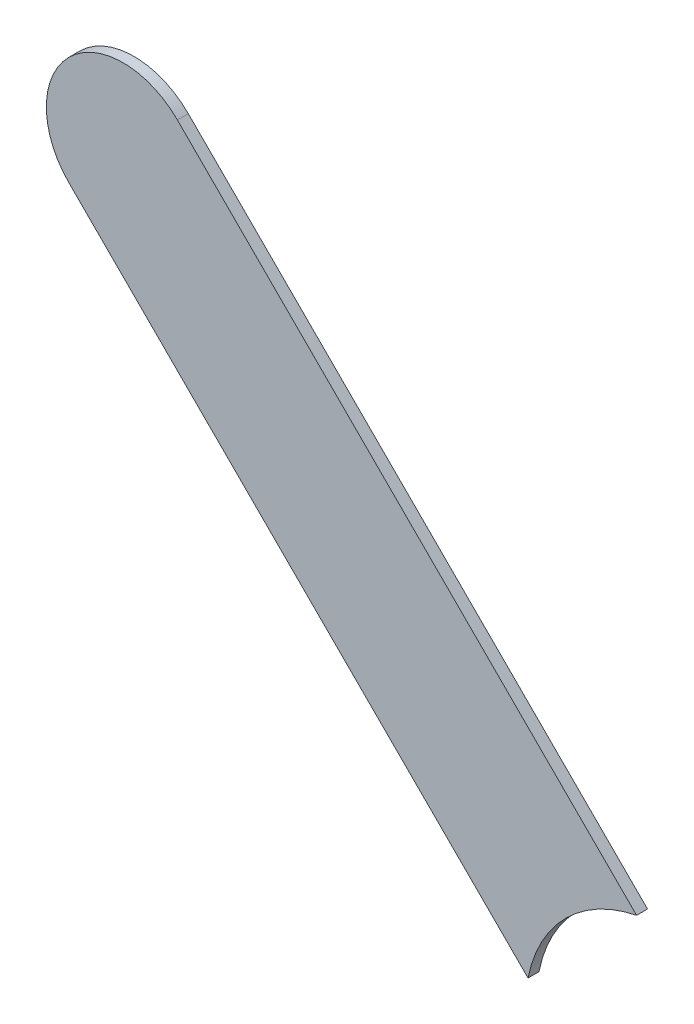
ISO-10303-21;
HEADER;
FILE_DESCRIPTION(('STEP AP214'),'2;1');
FILE_NAME('part.step','',(''),(''),'','','');
FILE_SCHEMA(('AUTOMOTIVE_DESIGN { 1 0 10303 214 1 1 1 1 }'));
ENDSEC;
DATA;
#1=APPLICATION_CONTEXT('core data for automotive mechanical design processes');
#2=APPLICATION_PROTOCOL_DEFINITION('international standard','automotive_design',2000,#1);
#3=PRODUCT_CONTEXT('',#1,'mechanical');
#4=PRODUCT('Part','Part','',(#3));
#5=PRODUCT_RELATED_PRODUCT_CATEGORY('part','',(#4));
#6=PRODUCT_DEFINITION_FORMATION('','',#4);
#7=PRODUCT_DEFINITION_CONTEXT('part definition',#1,'design');
#8=PRODUCT_DEFINITION('design','',#6,#7);
#9=PRODUCT_DEFINITION_SHAPE('','',#8);
#10=(LENGTH_UNIT() NAMED_UNIT(*) SI_UNIT(.MILLI.,.METRE.));
#11=(NAMED_UNIT(*) PLANE_ANGLE_UNIT() SI_UNIT($,.RADIAN.));
#12=(NAMED_UNIT(*) SI_UNIT($,.STERADIAN.) SOLID_ANGLE_UNIT());
#13=UNCERTAINTY_MEASURE_WITH_UNIT(LENGTH_MEASURE(1.E-05),#10,'distance_accuracy_value','');
#14=(GEOMETRIC_REPRESENTATION_CONTEXT(3) GLOBAL_UNCERTAINTY_ASSIGNED_CONTEXT((#13)) GLOBAL_UNIT_ASSIGNED_CONTEXT((#10,
#11,#12)) REPRESENTATION_CONTEXT('',''));
#15=CARTESIAN_POINT('',(0.,0.,0.));
#16=DIRECTION('',(0.,0.,1.));
#17=DIRECTION('',(1.,0.,0.));
#18=AXIS2_PLACEMENT_3D('',#15,#16,#17);
#19=CARTESIAN_POINT('',(43.92321162,55.5832391,0.));
#20=DIRECTION('',(0.707106781186546,0.707106781186549,0.));
#21=DIRECTION('',(0.707106781186549,-0.707106781186546,0.));
#22=AXIS2_PLACEMENT_3D('',#19,#20,#21);
#23=PLANE('',#22);
#24=DIRECTION('',(0.707106781186549,-0.707106781186546,0.));
#25=VECTOR('',#24,1.);
#26=CARTESIAN_POINT('',(43.92321162,55.5832391,0.03556));
#27=LINE('',#26,#25);
#28=CARTESIAN_POINT('',(43.92321162,55.5832391,0.03556));
#29=VERTEX_POINT('',#28);
#30=CARTESIAN_POINT('',(45.4186589236052,54.0877917963948,0.03556));
#31=VERTEX_POINT('',#30);
#32=EDGE_CURVE('E11',#29,#31,#27,.T.);
#33=ORIENTED_EDGE('',*,*,#32,.F.);
#34=DIRECTION('',(0.,0.,1.));
#35=VECTOR('',#34,1.);
#36=CARTESIAN_POINT('',(43.92321162,55.5832391,0.));
#37=LINE('',#36,#35);
#38=CARTESIAN_POINT('',(43.92321162,55.5832391,0.));
#39=VERTEX_POINT('',#38);
#40=EDGE_CURVE('E24',#39,#29,#37,.T.);
#41=ORIENTED_EDGE('',*,*,#40,.F.);
#42=DIRECTION('',(0.707106781186549,-0.707106781186546,0.));
#43=VECTOR('',#42,1.);
#44=CARTESIAN_POINT('',(43.92321162,55.5832391,0.));
#45=LINE('',#44,#43);
#46=CARTESIAN_POINT('',(45.4186589236052,54.0877917963948,0.));
#47=VERTEX_POINT('',#46);
#48=EDGE_CURVE('E75',#39,#47,#45,.T.);
#49=ORIENTED_EDGE('',*,*,#48,.T.);
#50=DIRECTION('',(0.,0.,1.));
#51=VECTOR('',#50,1.);
#52=CARTESIAN_POINT('',(45.4186589236052,54.0877917963948,0.));
#53=LINE('',#52,#51);
#54=EDGE_CURVE('E37',#47,#31,#53,.T.);
#55=ORIENTED_EDGE('',*,*,#54,.T.);
#56=EDGE_LOOP('',(#33,#41,#49,#55));
#57=FACE_BOUND('',#56,.T.);
#58=ADVANCED_FACE('F17',(#57),#23,.F.);
#59=CARTESIAN_POINT('',(45.86000988,53.9999936,0.));
#60=DIRECTION('',(0.,0.,-1.));
#61=DIRECTION('',(1.,0.,0.));
#62=AXIS2_PLACEMENT_3D('',#59,#60,#61);
#63=CYLINDRICAL_SURFACE('',#62,0.4499991);
#64=DIRECTION('',(0.,0.,1.));
#65=VECTOR('',#64,1.);
#66=CARTESIAN_POINT('',(45.7722116836052,54.4413445563948,0.));
#67=LINE('',#66,#65);
#68=CARTESIAN_POINT('',(45.7722116836052,54.4413445563948,0.));
#69=VERTEX_POINT('',#68);
#70=CARTESIAN_POINT('',(45.7722116836052,54.4413445563948,0.03556));
#71=VERTEX_POINT('',#70);
#72=EDGE_CURVE('E67',#69,#71,#67,.T.);
#73=ORIENTED_EDGE('',*,*,#72,.T.);
#74=CARTESIAN_POINT('',(45.86000988,53.9999936,0.03556));
#75=DIRECTION('',(0.,0.,1.));
#76=DIRECTION('',(1.,0.,0.));
#77=AXIS2_PLACEMENT_3D('',#74,#75,#76);
#78=CIRCLE('',#77,0.4499991);
#79=EDGE_CURVE('E82',#71,#31,#78,.T.);
#80=ORIENTED_EDGE('',*,*,#79,.T.);
#81=ORIENTED_EDGE('',*,*,#54,.F.);
#82=CARTESIAN_POINT('',(45.86000988,53.9999936,0.));
#83=DIRECTION('',(0.,0.,1.));
#84=DIRECTION('',(1.,0.,0.));
#85=AXIS2_PLACEMENT_3D('',#82,#83,#84);
#86=CIRCLE('',#85,0.4499991);
#87=EDGE_CURVE('E80',#69,#47,#86,.T.);
#88=ORIENTED_EDGE('',*,*,#87,.F.);
#89=EDGE_LOOP('',(#73,#80,#81,#88));
#90=FACE_BOUND('',#89,.T.);
#91=ADVANCED_FACE('F88',(#90),#63,.F.);
#92=CARTESIAN_POINT('',(45.7722116836052,54.4413445563948,0.));
#93=DIRECTION('',(-0.707106781186548,-0.707106781186548,0.));
#94=DIRECTION('',(-0.707106781186548,0.707106781186548,0.));
#95=AXIS2_PLACEMENT_3D('',#92,#93,#94);
#96=PLANE('',#95);
#97=DIRECTION('',(-0.707106781186548,0.707106781186548,0.));
#98=VECTOR('',#97,1.);
#99=CARTESIAN_POINT('',(46.03678626,54.17676998,0.03556));
#100=LINE('',#99,#98);
#101=CARTESIAN_POINT('',(44.27676438,55.93679186,0.03556));
#102=VERTEX_POINT('',#101);
#103=EDGE_CURVE('E71',#71,#102,#100,.T.);
#104=ORIENTED_EDGE('',*,*,#103,.F.);
#105=ORIENTED_EDGE('',*,*,#72,.F.);
#106=DIRECTION('',(-0.707106781186548,0.707106781186548,0.));
#107=VECTOR('',#106,1.);
#108=CARTESIAN_POINT('',(46.03678626,54.17676998,0.));
#109=LINE('',#108,#107);
#110=CARTESIAN_POINT('',(44.27676438,55.93679186,0.));
#111=VERTEX_POINT('',#110);
#112=EDGE_CURVE('E63',#69,#111,#109,.T.);
#113=ORIENTED_EDGE('',*,*,#112,.T.);
#114=DIRECTION('',(0.,0.,1.));
#115=VECTOR('',#114,1.);
#116=CARTESIAN_POINT('',(44.27676438,55.93679186,0.));
#117=LINE('',#116,#115);
#118=EDGE_CURVE('E53',#111,#102,#117,.T.);
#119=ORIENTED_EDGE('',*,*,#118,.T.);
#120=EDGE_LOOP('',(#104,#105,#113,#119));
#121=FACE_BOUND('',#120,.T.);
#122=ADVANCED_FACE('F66',(#121),#96,.F.);
#123=CARTESIAN_POINT('',(44.099988,55.76001548,0.));
#124=DIRECTION('',(0.,0.,-1.));
#125=DIRECTION('',(0.707106781186533,0.707106781186562,0.));
#126=AXIS2_PLACEMENT_3D('',#123,#124,#125);
#127=CYLINDRICAL_SURFACE('',#126,0.249999554103223);
#128=CARTESIAN_POINT('',(44.099988,55.76001548,0.03556));
#129=DIRECTION('',(0.,0.,1.));
#130=DIRECTION('',(0.707106781186533,0.707106781186562,0.));
#131=AXIS2_PLACEMENT_3D('',#128,#129,#130);
#132=CIRCLE('',#131,0.249999554103223);
#133=EDGE_CURVE('E59',#102,#29,#132,.T.);
#134=ORIENTED_EDGE('',*,*,#133,.F.);
#135=ORIENTED_EDGE('',*,*,#118,.F.);
#136=CARTESIAN_POINT('',(44.099988,55.76001548,0.));
#137=DIRECTION('',(0.,0.,1.));
#138=DIRECTION('',(0.707106781186533,0.707106781186562,0.));
#139=AXIS2_PLACEMENT_3D('',#136,#137,#138);
#140=CIRCLE('',#139,0.249999554103223);
#141=EDGE_CURVE('E57',#111,#39,#140,.T.);
#142=ORIENTED_EDGE('',*,*,#141,.T.);
#143=ORIENTED_EDGE('',*,*,#40,.T.);
#144=EDGE_LOOP('',(#134,#135,#142,#143));
#145=FACE_BOUND('',#144,.T.);
#146=ADVANCED_FACE('F55',(#145),#127,.T.);
#147=CARTESIAN_POINT('',(43.92321162,55.5832391,0.));
#148=DIRECTION('',(0.,0.,-1.));
#149=DIRECTION('',(-1.,0.,0.));
#150=AXIS2_PLACEMENT_3D('',#147,#148,#149);
#151=PLANE('',#150);
#152=ORIENTED_EDGE('',*,*,#48,.F.);
#153=ORIENTED_EDGE('',*,*,#141,.F.);
#154=ORIENTED_EDGE('',*,*,#112,.F.);
#155=ORIENTED_EDGE('',*,*,#87,.T.);
#156=EDGE_LOOP('',(#152,#153,#154,#155));
#157=FACE_BOUND('',#156,.T.);
#158=ADVANCED_FACE('F74',(#157),#151,.T.);
#159=CARTESIAN_POINT('',(43.92321162,55.5832391,0.03556));
#160=DIRECTION('',(0.,0.,-1.));
#161=DIRECTION('',(-1.,0.,0.));
#162=AXIS2_PLACEMENT_3D('',#159,#160,#161);
#163=PLANE('',#162);
#164=ORIENTED_EDGE('',*,*,#133,.T.);
#165=ORIENTED_EDGE('',*,*,#32,.T.);
#166=ORIENTED_EDGE('',*,*,#79,.F.);
#167=ORIENTED_EDGE('',*,*,#103,.T.);
#168=EDGE_LOOP('',(#164,#165,#166,#167));
#169=FACE_BOUND('',#168,.T.);
#170=ADVANCED_FACE('F91',(#169),#163,.F.);
#171=CLOSED_SHELL('',(#58,#91,#122,#146,#158,#170));
#172=MANIFOLD_SOLID_BREP('B1',#171);
#173=ADVANCED_BREP_SHAPE_REPRESENTATION('',(#18,#172),#14);
#174=SHAPE_DEFINITION_REPRESENTATION(#9,#173);
ENDSEC;
END-ISO-10303-21;
